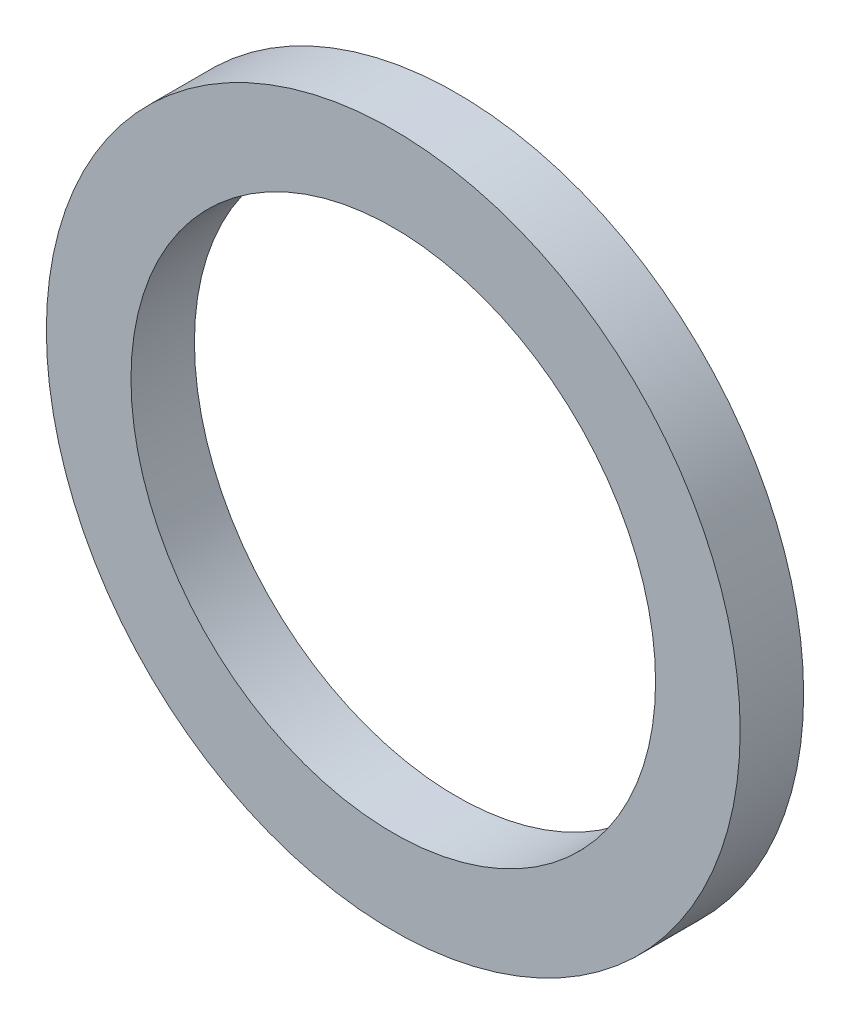
ISO-10303-21;
HEADER;
FILE_DESCRIPTION(('STEP AP214'),'2;1');
FILE_NAME('part.step','',(''),(''),'','','');
FILE_SCHEMA(('AUTOMOTIVE_DESIGN { 1 0 10303 214 1 1 1 1 }'));
ENDSEC;
DATA;
#1=APPLICATION_CONTEXT('core data for automotive mechanical design processes');
#2=APPLICATION_PROTOCOL_DEFINITION('international standard','automotive_design',2000,#1);
#3=PRODUCT_CONTEXT('',#1,'mechanical');
#4=PRODUCT('Part','Part','',(#3));
#5=PRODUCT_RELATED_PRODUCT_CATEGORY('part','',(#4));
#6=PRODUCT_DEFINITION_FORMATION('','',#4);
#7=PRODUCT_DEFINITION_CONTEXT('part definition',#1,'design');
#8=PRODUCT_DEFINITION('design','',#6,#7);
#9=PRODUCT_DEFINITION_SHAPE('','',#8);
#10=(LENGTH_UNIT() NAMED_UNIT(*) SI_UNIT(.MILLI.,.METRE.));
#11=(NAMED_UNIT(*) PLANE_ANGLE_UNIT() SI_UNIT($,.RADIAN.));
#12=(NAMED_UNIT(*) SI_UNIT($,.STERADIAN.) SOLID_ANGLE_UNIT());
#13=UNCERTAINTY_MEASURE_WITH_UNIT(LENGTH_MEASURE(1.E-05),#10,'distance_accuracy_value','');
#14=(GEOMETRIC_REPRESENTATION_CONTEXT(3) GLOBAL_UNCERTAINTY_ASSIGNED_CONTEXT((#13)) GLOBAL_UNIT_ASSIGNED_CONTEXT((#10,
#11,#12)) REPRESENTATION_CONTEXT('',''));
#15=CARTESIAN_POINT('',(0.,0.,0.));
#16=DIRECTION('',(0.,0.,1.));
#17=DIRECTION('',(1.,0.,0.));
#18=AXIS2_PLACEMENT_3D('',#15,#16,#17);
#19=CARTESIAN_POINT('',(0.,0.,0.750000000000001));
#20=DIRECTION('',(0.,0.,1.));
#21=DIRECTION('',(1.,0.,0.));
#22=AXIS2_PLACEMENT_3D('',#19,#20,#21);
#23=PLANE('',#22);
#24=CARTESIAN_POINT('',(0.,0.,0.750000000000001));
#25=DIRECTION('',(0.,0.,1.));
#26=DIRECTION('',(1.,0.,0.));
#27=AXIS2_PLACEMENT_3D('',#24,#25,#26);
#28=CIRCLE('',#27,4.1);
#29=CARTESIAN_POINT('',(4.1,0.,0.750000000000001));
#30=VERTEX_POINT('',#29);
#31=EDGE_CURVE('E10',#30,#30,#28,.T.);
#32=ORIENTED_EDGE('',*,*,#31,.T.);
#33=EDGE_LOOP('',(#32));
#34=FACE_BOUND('',#33,.T.);
#35=CARTESIAN_POINT('',(0.,0.,0.750000000000001));
#36=DIRECTION('',(0.,0.,1.));
#37=DIRECTION('',(1.,0.,0.));
#38=AXIS2_PLACEMENT_3D('',#35,#36,#37);
#39=CIRCLE('',#38,3.1);
#40=CARTESIAN_POINT('',(3.1,0.,0.750000000000001));
#41=VERTEX_POINT('',#40);
#42=EDGE_CURVE('E41',#41,#41,#39,.T.);
#43=ORIENTED_EDGE('',*,*,#42,.F.);
#44=EDGE_LOOP('',(#43));
#45=FACE_BOUND('',#44,.T.);
#46=ADVANCED_FACE('F30',(#34,#45),#23,.T.);
#47=CARTESIAN_POINT('',(0.,0.,0.));
#48=DIRECTION('',(0.,0.,1.));
#49=DIRECTION('',(1.,0.,0.));
#50=AXIS2_PLACEMENT_3D('',#47,#48,#49);
#51=PLANE('',#50);
#52=CARTESIAN_POINT('',(0.,0.,0.));
#53=DIRECTION('',(0.,0.,1.));
#54=DIRECTION('',(1.,0.,0.));
#55=AXIS2_PLACEMENT_3D('',#52,#53,#54);
#56=CIRCLE('',#55,4.1);
#57=CARTESIAN_POINT('',(4.1,0.,0.));
#58=VERTEX_POINT('',#57);
#59=EDGE_CURVE('E37',#58,#58,#56,.T.);
#60=ORIENTED_EDGE('',*,*,#59,.F.);
#61=EDGE_LOOP('',(#60));
#62=FACE_BOUND('',#61,.T.);
#63=CARTESIAN_POINT('',(0.,0.,0.));
#64=DIRECTION('',(0.,0.,1.));
#65=DIRECTION('',(1.,0.,0.));
#66=AXIS2_PLACEMENT_3D('',#63,#64,#65);
#67=CIRCLE('',#66,3.1);
#68=CARTESIAN_POINT('',(3.1,0.,0.));
#69=VERTEX_POINT('',#68);
#70=EDGE_CURVE('E45',#69,#69,#67,.T.);
#71=ORIENTED_EDGE('',*,*,#70,.T.);
#72=EDGE_LOOP('',(#71));
#73=FACE_BOUND('',#72,.T.);
#74=ADVANCED_FACE('F51',(#62,#73),#51,.F.);
#75=CARTESIAN_POINT('',(0.,0.,0.750000000000001));
#76=DIRECTION('',(0.,0.,-1.));
#77=DIRECTION('',(-1.,0.,0.));
#78=AXIS2_PLACEMENT_3D('',#75,#76,#77);
#79=CYLINDRICAL_SURFACE('',#78,4.1);
#80=ORIENTED_EDGE('',*,*,#31,.F.);
#81=EDGE_LOOP('',(#80));
#82=FACE_BOUND('',#81,.T.);
#83=ORIENTED_EDGE('',*,*,#59,.T.);
#84=EDGE_LOOP('',(#83));
#85=FACE_BOUND('',#84,.T.);
#86=ADVANCED_FACE('F32',(#82,#85),#79,.T.);
#87=CARTESIAN_POINT('',(0.,0.,0.750000000000001));
#88=DIRECTION('',(0.,0.,-1.));
#89=DIRECTION('',(-1.,0.,0.));
#90=AXIS2_PLACEMENT_3D('',#87,#88,#89);
#91=CYLINDRICAL_SURFACE('',#90,3.1);
#92=ORIENTED_EDGE('',*,*,#42,.T.);
#93=EDGE_LOOP('',(#92));
#94=FACE_BOUND('',#93,.T.);
#95=ORIENTED_EDGE('',*,*,#70,.F.);
#96=EDGE_LOOP('',(#95));
#97=FACE_BOUND('',#96,.T.);
#98=ADVANCED_FACE('F53',(#94,#97),#91,.F.);
#99=CLOSED_SHELL('',(#46,#74,#86,#98));
#100=MANIFOLD_SOLID_BREP('B2',#99);
#101=ADVANCED_BREP_SHAPE_REPRESENTATION('',(#18,#100),#14);
#102=SHAPE_DEFINITION_REPRESENTATION(#9,#101);
ENDSEC;
END-ISO-10303-21;
